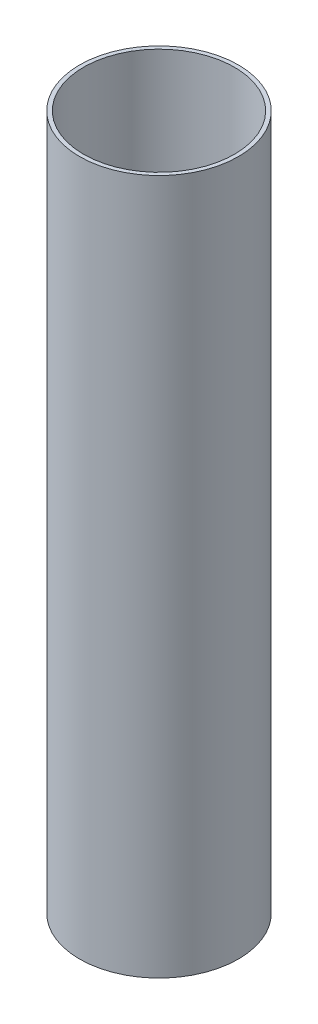
ISO-10303-21;
HEADER;
FILE_DESCRIPTION(('STEP AP214'),'2;1');
FILE_NAME('part.step','',(''),(''),'','','');
FILE_SCHEMA(('AUTOMOTIVE_DESIGN { 1 0 10303 214 1 1 1 1 }'));
ENDSEC;
DATA;
#1=APPLICATION_CONTEXT('core data for automotive mechanical design processes');
#2=APPLICATION_PROTOCOL_DEFINITION('international standard','automotive_design',2000,#1);
#3=PRODUCT_CONTEXT('',#1,'mechanical');
#4=PRODUCT('Part','Part','',(#3));
#5=PRODUCT_RELATED_PRODUCT_CATEGORY('part','',(#4));
#6=PRODUCT_DEFINITION_FORMATION('','',#4);
#7=PRODUCT_DEFINITION_CONTEXT('part definition',#1,'design');
#8=PRODUCT_DEFINITION('design','',#6,#7);
#9=PRODUCT_DEFINITION_SHAPE('','',#8);
#10=(LENGTH_UNIT() NAMED_UNIT(*) SI_UNIT(.MILLI.,.METRE.));
#11=(NAMED_UNIT(*) PLANE_ANGLE_UNIT() SI_UNIT($,.RADIAN.));
#12=(NAMED_UNIT(*) SI_UNIT($,.STERADIAN.) SOLID_ANGLE_UNIT());
#13=UNCERTAINTY_MEASURE_WITH_UNIT(LENGTH_MEASURE(1.E-05),#10,'distance_accuracy_value','');
#14=(GEOMETRIC_REPRESENTATION_CONTEXT(3) GLOBAL_UNCERTAINTY_ASSIGNED_CONTEXT((#13)) GLOBAL_UNIT_ASSIGNED_CONTEXT((#10,
#11,#12)) REPRESENTATION_CONTEXT('',''));
#15=CARTESIAN_POINT('',(0.,0.,0.));
#16=DIRECTION('',(0.,0.,1.));
#17=DIRECTION('',(1.,0.,0.));
#18=AXIS2_PLACEMENT_3D('',#15,#16,#17);
#19=CARTESIAN_POINT('',(0.,350.,0.));
#20=DIRECTION('',(0.,1.,0.));
#21=DIRECTION('',(0.,0.,1.));
#22=AXIS2_PLACEMENT_3D('',#19,#20,#21);
#23=PLANE('',#22);
#24=CARTESIAN_POINT('',(0.,350.,0.));
#25=DIRECTION('',(0.,1.,0.));
#26=DIRECTION('',(0.,0.,1.));
#27=AXIS2_PLACEMENT_3D('',#24,#25,#26);
#28=CIRCLE('',#27,40.);
#29=CARTESIAN_POINT('',(0.,350.,40.));
#30=VERTEX_POINT('',#29);
#31=EDGE_CURVE('E10',#30,#30,#28,.T.);
#32=ORIENTED_EDGE('',*,*,#31,.T.);
#33=EDGE_LOOP('',(#32));
#34=FACE_BOUND('',#33,.T.);
#35=CARTESIAN_POINT('',(0.,350.,0.));
#36=DIRECTION('',(0.,1.,0.));
#37=DIRECTION('',(0.,0.,1.));
#38=AXIS2_PLACEMENT_3D('',#35,#36,#37);
#39=CIRCLE('',#38,38.);
#40=CARTESIAN_POINT('',(0.,350.,38.));
#41=VERTEX_POINT('',#40);
#42=EDGE_CURVE('E42',#41,#41,#39,.T.);
#43=ORIENTED_EDGE('',*,*,#42,.F.);
#44=EDGE_LOOP('',(#43));
#45=FACE_BOUND('',#44,.T.);
#46=ADVANCED_FACE('F31',(#34,#45),#23,.T.);
#47=CARTESIAN_POINT('',(0.,0.,0.));
#48=DIRECTION('',(0.,1.,0.));
#49=DIRECTION('',(0.,0.,1.));
#50=AXIS2_PLACEMENT_3D('',#47,#48,#49);
#51=PLANE('',#50);
#52=CARTESIAN_POINT('',(0.,0.,0.));
#53=DIRECTION('',(0.,1.,0.));
#54=DIRECTION('',(0.,0.,1.));
#55=AXIS2_PLACEMENT_3D('',#52,#53,#54);
#56=CIRCLE('',#55,40.);
#57=CARTESIAN_POINT('',(0.,0.,40.));
#58=VERTEX_POINT('',#57);
#59=EDGE_CURVE('E35',#58,#58,#56,.T.);
#60=ORIENTED_EDGE('',*,*,#59,.F.);
#61=EDGE_LOOP('',(#60));
#62=FACE_BOUND('',#61,.T.);
#63=CARTESIAN_POINT('',(0.,0.,0.));
#64=DIRECTION('',(0.,1.,0.));
#65=DIRECTION('',(0.,0.,1.));
#66=AXIS2_PLACEMENT_3D('',#63,#64,#65);
#67=CIRCLE('',#66,38.);
#68=CARTESIAN_POINT('',(0.,0.,38.));
#69=VERTEX_POINT('',#68);
#70=EDGE_CURVE('E44',#69,#69,#67,.T.);
#71=ORIENTED_EDGE('',*,*,#70,.T.);
#72=EDGE_LOOP('',(#71));
#73=FACE_BOUND('',#72,.T.);
#74=ADVANCED_FACE('F54',(#62,#73),#51,.F.);
#75=CARTESIAN_POINT('',(0.,350.,0.));
#76=DIRECTION('',(0.,-1.,0.));
#77=DIRECTION('',(0.,0.,-1.));
#78=AXIS2_PLACEMENT_3D('',#75,#76,#77);
#79=CYLINDRICAL_SURFACE('',#78,40.);
#80=ORIENTED_EDGE('',*,*,#31,.F.);
#81=EDGE_LOOP('',(#80));
#82=FACE_BOUND('',#81,.T.);
#83=ORIENTED_EDGE('',*,*,#59,.T.);
#84=EDGE_LOOP('',(#83));
#85=FACE_BOUND('',#84,.T.);
#86=ADVANCED_FACE('F33',(#82,#85),#79,.T.);
#87=CARTESIAN_POINT('',(0.,350.,0.));
#88=DIRECTION('',(0.,-1.,0.));
#89=DIRECTION('',(0.,0.,-1.));
#90=AXIS2_PLACEMENT_3D('',#87,#88,#89);
#91=CYLINDRICAL_SURFACE('',#90,38.);
#92=ORIENTED_EDGE('',*,*,#42,.T.);
#93=EDGE_LOOP('',(#92));
#94=FACE_BOUND('',#93,.T.);
#95=ORIENTED_EDGE('',*,*,#70,.F.);
#96=EDGE_LOOP('',(#95));
#97=FACE_BOUND('',#96,.T.);
#98=ADVANCED_FACE('F50',(#94,#97),#91,.F.);
#99=CLOSED_SHELL('',(#46,#74,#86,#98));
#100=MANIFOLD_SOLID_BREP('B2',#99);
#101=ADVANCED_BREP_SHAPE_REPRESENTATION('',(#18,#100),#14);
#102=SHAPE_DEFINITION_REPRESENTATION(#9,#101);
ENDSEC;
END-ISO-10303-21;
